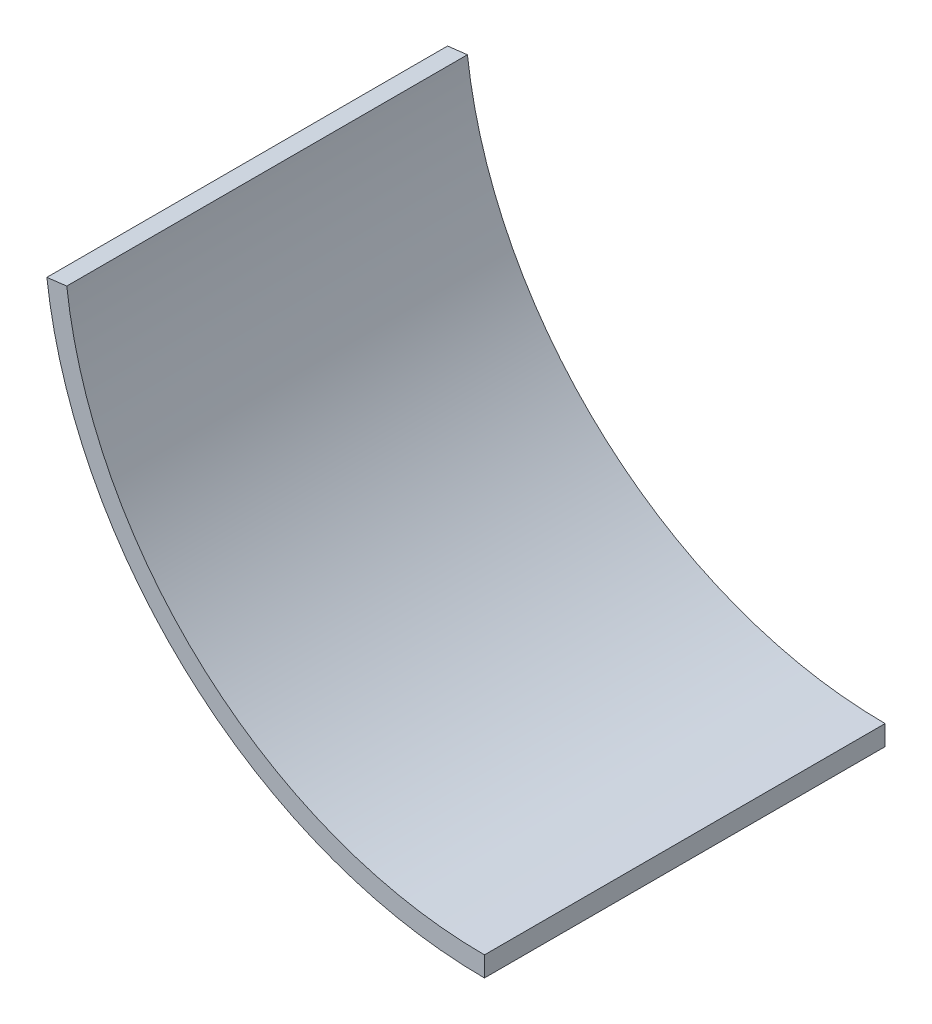
ISO-10303-21;
HEADER;
FILE_DESCRIPTION(('STEP AP214'),'2;1');
FILE_NAME('part.step','',(''),(''),'','','');
FILE_SCHEMA(('AUTOMOTIVE_DESIGN { 1 0 10303 214 1 1 1 1 }'));
ENDSEC;
DATA;
#1=APPLICATION_CONTEXT('core data for automotive mechanical design processes');
#2=APPLICATION_PROTOCOL_DEFINITION('international standard','automotive_design',2000,#1);
#3=PRODUCT_CONTEXT('',#1,'mechanical');
#4=PRODUCT('Part','Part','',(#3));
#5=PRODUCT_RELATED_PRODUCT_CATEGORY('part','',(#4));
#6=PRODUCT_DEFINITION_FORMATION('','',#4);
#7=PRODUCT_DEFINITION_CONTEXT('part definition',#1,'design');
#8=PRODUCT_DEFINITION('design','',#6,#7);
#9=PRODUCT_DEFINITION_SHAPE('','',#8);
#10=(LENGTH_UNIT() NAMED_UNIT(*) SI_UNIT(.MILLI.,.METRE.));
#11=(NAMED_UNIT(*) PLANE_ANGLE_UNIT() SI_UNIT($,.RADIAN.));
#12=(NAMED_UNIT(*) SI_UNIT($,.STERADIAN.) SOLID_ANGLE_UNIT());
#13=UNCERTAINTY_MEASURE_WITH_UNIT(LENGTH_MEASURE(1.E-05),#10,'distance_accuracy_value','');
#14=(GEOMETRIC_REPRESENTATION_CONTEXT(3) GLOBAL_UNCERTAINTY_ASSIGNED_CONTEXT((#13)) GLOBAL_UNIT_ASSIGNED_CONTEXT((#10,
#11,#12)) REPRESENTATION_CONTEXT('',''));
#15=CARTESIAN_POINT('',(0.,0.,0.));
#16=DIRECTION('',(0.,0.,1.));
#17=DIRECTION('',(1.,0.,0.));
#18=AXIS2_PLACEMENT_3D('',#15,#16,#17);
#19=CARTESIAN_POINT('',(-145.,-35.,20.));
#20=DIRECTION('',(0.,0.,-1.));
#21=DIRECTION('',(-1.,0.,0.));
#22=AXIS2_PLACEMENT_3D('',#19,#20,#21);
#23=CYLINDRICAL_SURFACE('',#22,21.);
#24=CARTESIAN_POINT('',(-145.,-35.,0.));
#25=DIRECTION('',(0.,0.,-1.));
#26=DIRECTION('',(-1.,0.,0.));
#27=AXIS2_PLACEMENT_3D('',#24,#25,#26);
#28=CIRCLE('',#27,21.);
#29=CARTESIAN_POINT('',(-145.,-56.,0.));
#30=VERTEX_POINT('',#29);
#31=CARTESIAN_POINT('',(-165.849119966711,-37.5128065213434,0.));
#32=VERTEX_POINT('',#31);
#33=EDGE_CURVE('E96',#30,#32,#28,.T.);
#34=ORIENTED_EDGE('',*,*,#33,.T.);
#35=DIRECTION('',(0.,0.,-1.));
#36=VECTOR('',#35,1.);
#37=CARTESIAN_POINT('',(-165.849119966711,-37.5128065213434,20.));
#38=LINE('',#37,#36);
#39=CARTESIAN_POINT('',(-165.849119966711,-37.5128065213434,20.));
#40=VERTEX_POINT('',#39);
#41=EDGE_CURVE('E11',#40,#32,#38,.T.);
#42=ORIENTED_EDGE('',*,*,#41,.F.);
#43=CARTESIAN_POINT('',(-145.,-35.,20.));
#44=DIRECTION('',(0.,0.,-1.));
#45=DIRECTION('',(-1.,0.,0.));
#46=AXIS2_PLACEMENT_3D('',#43,#44,#45);
#47=CIRCLE('',#46,21.);
#48=CARTESIAN_POINT('',(-145.,-56.,20.));
#49=VERTEX_POINT('',#48);
#50=EDGE_CURVE('E84',#49,#40,#47,.T.);
#51=ORIENTED_EDGE('',*,*,#50,.F.);
#52=DIRECTION('',(0.,0.,-1.));
#53=VECTOR('',#52,1.);
#54=CARTESIAN_POINT('',(-145.,-56.,20.));
#55=LINE('',#54,#53);
#56=EDGE_CURVE('E92',#49,#30,#55,.T.);
#57=ORIENTED_EDGE('',*,*,#56,.T.);
#58=EDGE_LOOP('',(#34,#42,#51,#57));
#59=FACE_BOUND('',#58,.T.);
#60=ADVANCED_FACE('F33',(#59),#23,.F.);
#61=CARTESIAN_POINT('',(-165.849119966711,-37.5128065213434,20.));
#62=DIRECTION('',(0.1196574533973,-0.992815236510033,0.));
#63=DIRECTION('',(0.992815236510033,0.1196574533973,0.));
#64=AXIS2_PLACEMENT_3D('',#61,#62,#63);
#65=PLANE('',#64);
#66=DIRECTION('',(-0.992815236510033,-0.1196574533973,0.));
#67=VECTOR('',#66,1.);
#68=CARTESIAN_POINT('',(-165.849119966711,-37.5128065213434,0.));
#69=LINE('',#68,#67);
#70=CARTESIAN_POINT('',(-166.841935203221,-37.6324639747407,0.));
#71=VERTEX_POINT('',#70);
#72=EDGE_CURVE('E88',#32,#71,#69,.T.);
#73=ORIENTED_EDGE('',*,*,#72,.T.);
#74=DIRECTION('',(0.,0.,-1.));
#75=VECTOR('',#74,1.);
#76=CARTESIAN_POINT('',(-166.841935203221,-37.6324639747407,20.));
#77=LINE('',#76,#75);
#78=CARTESIAN_POINT('',(-166.841935203221,-37.6324639747407,20.));
#79=VERTEX_POINT('',#78);
#80=EDGE_CURVE('E41',#79,#71,#77,.T.);
#81=ORIENTED_EDGE('',*,*,#80,.F.);
#82=DIRECTION('',(-0.992815236510033,-0.1196574533973,0.));
#83=VECTOR('',#82,1.);
#84=CARTESIAN_POINT('',(-165.849119966711,-37.5128065213434,20.));
#85=LINE('',#84,#83);
#86=EDGE_CURVE('E79',#40,#79,#85,.T.);
#87=ORIENTED_EDGE('',*,*,#86,.F.);
#88=ORIENTED_EDGE('',*,*,#41,.T.);
#89=EDGE_LOOP('',(#73,#81,#87,#88));
#90=FACE_BOUND('',#89,.T.);
#91=ADVANCED_FACE('F87',(#90),#65,.F.);
#92=CARTESIAN_POINT('',(-145.,-35.,20.));
#93=DIRECTION('',(0.,0.,-1.));
#94=DIRECTION('',(-1.,0.,0.));
#95=AXIS2_PLACEMENT_3D('',#92,#93,#94);
#96=CYLINDRICAL_SURFACE('',#95,22.);
#97=CARTESIAN_POINT('',(-145.,-35.,0.));
#98=DIRECTION('',(0.,0.,1.));
#99=DIRECTION('',(-1.,0.,0.));
#100=AXIS2_PLACEMENT_3D('',#97,#98,#99);
#101=CIRCLE('',#100,22.);
#102=CARTESIAN_POINT('',(-145.,-57.,0.));
#103=VERTEX_POINT('',#102);
#104=EDGE_CURVE('E66',#71,#103,#101,.T.);
#105=ORIENTED_EDGE('',*,*,#104,.T.);
#106=DIRECTION('',(0.,0.,-1.));
#107=VECTOR('',#106,1.);
#108=CARTESIAN_POINT('',(-145.,-57.,20.));
#109=LINE('',#108,#107);
#110=CARTESIAN_POINT('',(-145.,-57.,20.));
#111=VERTEX_POINT('',#110);
#112=EDGE_CURVE('E89',#111,#103,#109,.T.);
#113=ORIENTED_EDGE('',*,*,#112,.F.);
#114=CARTESIAN_POINT('',(-145.,-35.,20.));
#115=DIRECTION('',(0.,0.,1.));
#116=DIRECTION('',(-1.,0.,0.));
#117=AXIS2_PLACEMENT_3D('',#114,#115,#116);
#118=CIRCLE('',#117,22.);
#119=EDGE_CURVE('E82',#79,#111,#118,.T.);
#120=ORIENTED_EDGE('',*,*,#119,.F.);
#121=ORIENTED_EDGE('',*,*,#80,.T.);
#122=EDGE_LOOP('',(#105,#113,#120,#121));
#123=FACE_BOUND('',#122,.T.);
#124=ADVANCED_FACE('F90',(#123),#96,.T.);
#125=CARTESIAN_POINT('',(-145.,-56.,20.));
#126=DIRECTION('',(-1.,0.,0.));
#127=DIRECTION('',(0.,0.,1.));
#128=AXIS2_PLACEMENT_3D('',#125,#126,#127);
#129=PLANE('',#128);
#130=DIRECTION('',(0.,1.,0.));
#131=VECTOR('',#130,1.);
#132=CARTESIAN_POINT('',(-145.,-56.,0.));
#133=LINE('',#132,#131);
#134=EDGE_CURVE('E72',#103,#30,#133,.T.);
#135=ORIENTED_EDGE('',*,*,#134,.T.);
#136=ORIENTED_EDGE('',*,*,#56,.F.);
#137=DIRECTION('',(0.,1.,0.));
#138=VECTOR('',#137,1.);
#139=CARTESIAN_POINT('',(-145.,-56.,20.));
#140=LINE('',#139,#138);
#141=EDGE_CURVE('E49',#111,#49,#140,.T.);
#142=ORIENTED_EDGE('',*,*,#141,.F.);
#143=ORIENTED_EDGE('',*,*,#112,.T.);
#144=EDGE_LOOP('',(#135,#136,#142,#143));
#145=FACE_BOUND('',#144,.T.);
#146=ADVANCED_FACE('F103',(#145),#129,.F.);
#147=CARTESIAN_POINT('',(-145.,-35.,20.));
#148=DIRECTION('',(0.,0.,-1.));
#149=DIRECTION('',(-1.,0.,0.));
#150=AXIS2_PLACEMENT_3D('',#147,#148,#149);
#151=PLANE('',#150);
#152=ORIENTED_EDGE('',*,*,#50,.T.);
#153=ORIENTED_EDGE('',*,*,#86,.T.);
#154=ORIENTED_EDGE('',*,*,#119,.T.);
#155=ORIENTED_EDGE('',*,*,#141,.T.);
#156=EDGE_LOOP('',(#152,#153,#154,#155));
#157=FACE_BOUND('',#156,.T.);
#158=ADVANCED_FACE('F80',(#157),#151,.F.);
#159=CARTESIAN_POINT('',(-145.,-35.,0.));
#160=DIRECTION('',(0.,0.,-1.));
#161=DIRECTION('',(-1.,0.,0.));
#162=AXIS2_PLACEMENT_3D('',#159,#160,#161);
#163=PLANE('',#162);
#164=ORIENTED_EDGE('',*,*,#33,.F.);
#165=ORIENTED_EDGE('',*,*,#134,.F.);
#166=ORIENTED_EDGE('',*,*,#104,.F.);
#167=ORIENTED_EDGE('',*,*,#72,.F.);
#168=EDGE_LOOP('',(#164,#165,#166,#167));
#169=FACE_BOUND('',#168,.T.);
#170=ADVANCED_FACE('F106',(#169),#163,.T.);
#171=CLOSED_SHELL('',(#60,#91,#124,#146,#158,#170));
#172=MANIFOLD_SOLID_BREP('B2',#171);
#173=ADVANCED_BREP_SHAPE_REPRESENTATION('',(#18,#172),#14);
#174=SHAPE_DEFINITION_REPRESENTATION(#9,#173);
ENDSEC;
END-ISO-10303-21;
